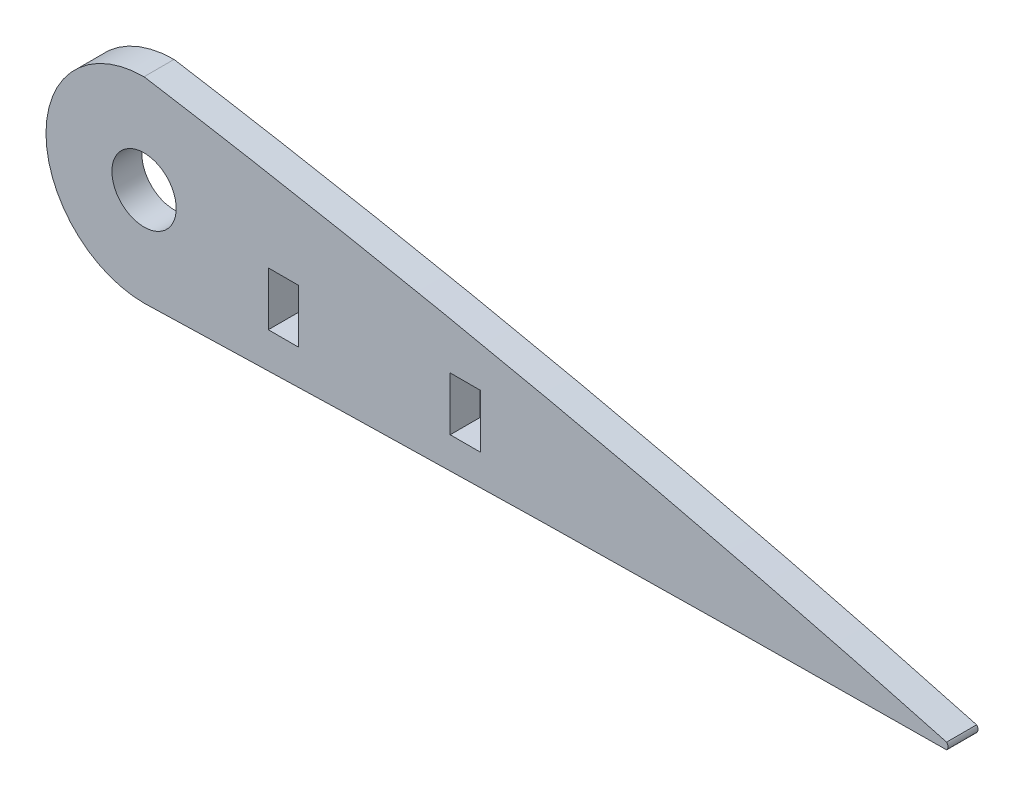
ISO-10303-21;
HEADER;
FILE_DESCRIPTION(('STEP AP214'),'2;1');
FILE_NAME('part.step','',(''),(''),'','','');
FILE_SCHEMA(('AUTOMOTIVE_DESIGN { 1 0 10303 214 1 1 1 1 }'));
ENDSEC;
DATA;
#1=APPLICATION_CONTEXT('core data for automotive mechanical design processes');
#2=APPLICATION_PROTOCOL_DEFINITION('international standard','automotive_design',2000,#1);
#3=PRODUCT_CONTEXT('',#1,'mechanical');
#4=PRODUCT('Part','Part','',(#3));
#5=PRODUCT_RELATED_PRODUCT_CATEGORY('part','',(#4));
#6=PRODUCT_DEFINITION_FORMATION('','',#4);
#7=PRODUCT_DEFINITION_CONTEXT('part definition',#1,'design');
#8=PRODUCT_DEFINITION('design','',#6,#7);
#9=PRODUCT_DEFINITION_SHAPE('','',#8);
#10=(LENGTH_UNIT() NAMED_UNIT(*) SI_UNIT(.MILLI.,.METRE.));
#11=(NAMED_UNIT(*) PLANE_ANGLE_UNIT() SI_UNIT($,.RADIAN.));
#12=(NAMED_UNIT(*) SI_UNIT($,.STERADIAN.) SOLID_ANGLE_UNIT());
#13=UNCERTAINTY_MEASURE_WITH_UNIT(LENGTH_MEASURE(1.E-05),#10,'distance_accuracy_value','');
#14=(GEOMETRIC_REPRESENTATION_CONTEXT(3) GLOBAL_UNCERTAINTY_ASSIGNED_CONTEXT((#13)) GLOBAL_UNIT_ASSIGNED_CONTEXT((#10,
#11,#12)) REPRESENTATION_CONTEXT('',''));
#15=CARTESIAN_POINT('',(0.,0.,0.));
#16=DIRECTION('',(0.,0.,1.));
#17=DIRECTION('',(1.,0.,0.));
#18=AXIS2_PLACEMENT_3D('',#15,#16,#17);
#19=CARTESIAN_POINT('',(249.685,0.,1.4));
#20=DIRECTION('',(0.,0.,-1.));
#21=DIRECTION('',(-1.,0.,0.));
#22=AXIS2_PLACEMENT_3D('',#19,#20,#21);
#23=CYLINDRICAL_SURFACE('',#22,0.445477272147512);
#24=CARTESIAN_POINT('',(249.685,0.,-1.4));
#25=DIRECTION('',(0.,0.,1.));
#26=DIRECTION('',(1.,0.,0.));
#27=AXIS2_PLACEMENT_3D('',#24,#25,#26);
#28=CIRCLE('',#27,0.445477272147512);
#29=CARTESIAN_POINT('',(250.,0.315,-1.4));
#30=VERTEX_POINT('',#29);
#31=CARTESIAN_POINT('',(250.,-0.315,-1.4));
#32=VERTEX_POINT('',#31);
#33=EDGE_CURVE('E265',#30,#32,#28,.F.);
#34=ORIENTED_EDGE('',*,*,#33,.F.);
#35=DIRECTION('',(0.,0.,-1.));
#36=VECTOR('',#35,1.);
#37=CARTESIAN_POINT('',(250.,0.315,1.4));
#38=LINE('',#37,#36);
#39=CARTESIAN_POINT('',(250.,0.315,1.4));
#40=VERTEX_POINT('',#39);
#41=EDGE_CURVE('E11',#40,#30,#38,.T.);
#42=ORIENTED_EDGE('',*,*,#41,.F.);
#43=CARTESIAN_POINT('',(249.685,0.,1.4));
#44=DIRECTION('',(0.,0.,1.));
#45=DIRECTION('',(1.,0.,0.));
#46=AXIS2_PLACEMENT_3D('',#43,#44,#45);
#47=CIRCLE('',#46,0.445477272147512);
#48=CARTESIAN_POINT('',(250.,-0.315,1.4));
#49=VERTEX_POINT('',#48);
#50=EDGE_CURVE('E146',#40,#49,#47,.F.);
#51=ORIENTED_EDGE('',*,*,#50,.T.);
#52=DIRECTION('',(0.,0.,-1.));
#53=VECTOR('',#52,1.);
#54=CARTESIAN_POINT('',(250.,-0.315,1.4));
#55=LINE('',#54,#53);
#56=EDGE_CURVE('E107',#49,#32,#55,.T.);
#57=ORIENTED_EDGE('',*,*,#56,.T.);
#58=EDGE_LOOP('',(#34,#42,#51,#57));
#59=FACE_BOUND('',#58,.T.);
#60=ADVANCED_FACE('F41',(#59),#23,.T.);
#61=CARTESIAN_POINT('',(250.,0.315,1.4));
#62=CARTESIAN_POINT('',(249.1556677398,0.545019817836279,1.4));
#63=CARTESIAN_POINT('',(246.72017569763,1.20851624251313,1.4));
#64=CARTESIAN_POINT('',(242.39133208333,2.35833905261626,1.4));
#65=CARTESIAN_POINT('',(236.8497612043,3.78762536446423,1.4));
#66=CARTESIAN_POINT('',(230.779918279366,5.29800883725429,1.4));
#67=CARTESIAN_POINT('',(224.455917947462,6.81286602762795,1.4));
#68=CARTESIAN_POINT('',(218.030543495663,8.2916106324586,1.4));
#69=CARTESIAN_POINT('',(211.562405044606,9.71973505661334,1.4));
#70=CARTESIAN_POINT('',(205.072411508973,11.0923749324442,1.4));
#71=CARTESIAN_POINT('',(198.567970912658,12.4078507263971,1.4));
#72=CARTESIAN_POINT('',(192.05236991352,13.6652979238497,1.4));
#73=CARTESIAN_POINT('',(185.527619972818,14.8640933031022,1.4));
#74=CARTESIAN_POINT('',(178.995338991115,16.0034047787228,1.4));
#75=CARTESIAN_POINT('',(172.457064741278,17.0823881152075,1.4));
#76=CARTESIAN_POINT('',(165.914317094847,18.0998278411168,1.4));
#77=CARTESIAN_POINT('',(159.368680729007,19.0545018148018,1.4));
#78=CARTESIAN_POINT('',(152.821805127969,19.9448856028229,1.4));
#79=CARTESIAN_POINT('',(146.275439401362,20.76928218283,1.4));
#80=CARTESIAN_POINT('',(139.731359791294,21.5256761133202,1.4));
#81=CARTESIAN_POINT('',(133.191836730309,22.2120042488889,1.4));
#82=CARTESIAN_POINT('',(126.658683026114,22.8257214286805,1.4));
#83=CARTESIAN_POINT('',(120.136770918309,23.363973266088,1.4));
#84=CARTESIAN_POINT('',(113.628567140501,23.8246773240715,1.4));
#85=CARTESIAN_POINT('',(107.152732037453,24.2002425936989,1.4));
#86=CARTESIAN_POINT('',(100.741095692949,24.4983995100481,1.4));
#87=CARTESIAN_POINT('',(94.4117527148801,24.6866497684384,1.4));
#88=CARTESIAN_POINT('',(88.1559179929208,24.7400956502598,1.4));
#89=CARTESIAN_POINT('',(81.9490430552625,24.658849143563,1.4));
#90=CARTESIAN_POINT('',(75.7805205915729,24.4410138083138,1.4));
#91=CARTESIAN_POINT('',(69.653692942001,24.0818848206021,1.4));
#92=CARTESIAN_POINT('',(63.5754105017725,23.5780063609574,1.4));
#93=CARTESIAN_POINT('',(57.5551895509689,22.9249466580897,1.4));
#94=CARTESIAN_POINT('',(51.6057626883655,22.1190655216041,1.4));
#95=CARTESIAN_POINT('',(45.7444003114454,21.1565644320825,1.4));
#96=CARTESIAN_POINT('',(39.9958575941734,20.035371389506,1.4));
#97=CARTESIAN_POINT('',(34.397919842374,18.756316234168,1.4));
#98=CARTESIAN_POINT('',(29.0103821035244,17.327615607561,1.4));
#99=CARTESIAN_POINT('',(23.9257984082512,15.7718649214876,1.4));
#100=CARTESIAN_POINT('',(19.2706788398757,14.1342694339559,1.4));
#101=CARTESIAN_POINT('',(15.1790983912921,12.4833354375465,1.4));
#102=CARTESIAN_POINT('',(11.7404757900967,10.8956109948061,1.4));
#103=CARTESIAN_POINT('',(8.95937186897629,9.42957736532332,1.4));
#104=CARTESIAN_POINT('',(6.76089118010329,8.10860319940964,1.4));
#105=CARTESIAN_POINT('',(5.03370974806799,6.92463805475642,1.4));
#106=CARTESIAN_POINT('',(3.67169493343308,5.85422966432144,1.4));
#107=CARTESIAN_POINT('',(2.59210112319415,4.87130536863603,1.4));
#108=CARTESIAN_POINT('',(1.73817566850273,3.95259574329487,1.4));
#109=CARTESIAN_POINT('',(1.06987082981603,3.08094637334676,1.4));
#110=CARTESIAN_POINT('',(0.571645410381898,2.24162210227498,1.4));
#111=CARTESIAN_POINT('',(0.215773898828885,1.43078539700941,1.4));
#112=CARTESIAN_POINT('',(0.102255581551055,0.88324169451159,1.4));
#113=CARTESIAN_POINT('',(0.047975,0.621425,1.4));
#114=B_SPLINE_CURVE_WITH_KNOTS('',3,(#61,#62,#63,#64,#65,#66,#67,#68,#69,#70,#71,#72,#73,#74,
#75,#76,#77,#78,#79,#80,#81,#82,#83,#84,#85,#86,#87,#88,#89,#90,#91,#92,#93,#94,#95,#96,#97,#98,
#99,#100,#101,#102,#103,#104,#105,#106,#107,#108,#109,#110,#111,#112,#113),.UNSPECIFIED.,.F.,
.F.,(4,1,1,1,1,1,1,1,1,1,1,1,1,1,1,1,1,1,1,1,1,1,1,1,1,1,1,1,1,1,1,1,1,1,1,1,1,1,1,1,1,1,1,1,1,
1,1,1,1,1,4),(0.,0.0101621996718152,0.029313053164405,0.0520116049167946,0.0766194676467142,
0.101948061207292,0.127526131749972,0.153184130655642,0.178867887696566,0.204557902716051,
0.230245711588722,0.255925967287604,0.281594302232909,0.307246419826604,0.332878041533464,
0.358484538095463,0.384061185999046,0.409602822472883,0.435103874040524,0.460559416336008,
0.485959195382529,0.511303069995141,0.53655151535457,0.561723365940153,0.586628866723787,
0.611085431247163,0.63525120042125,0.659272175841394,0.683163753229342,0.706922144180534,
0.730535909866309,0.753983199646257,0.777234690063445,0.800246382303428,0.822950708941546,
0.845237155368769,0.866915895838024,0.887662334604257,0.906968280539555,0.924203157053238,
0.938878974509372,0.95093161065299,0.960693484285195,0.968646729467272,0.975232933115936,
0.980794743901537,0.985583761312909,0.989781538836832,0.99352131251264,0.996902112954681,1.),.UNSPECIFIED.);
#115=DIRECTION('',(0.,0.,-1.));
#116=VECTOR('',#115,1.);
#117=SURFACE_OF_LINEAR_EXTRUSION('',#114,#116);
#118=CARTESIAN_POINT('',(250.,0.315,-1.4));
#119=CARTESIAN_POINT('',(249.1556677398,0.545019817836279,-1.4));
#120=CARTESIAN_POINT('',(246.72017569763,1.20851624251313,-1.4));
#121=CARTESIAN_POINT('',(242.39133208333,2.35833905261626,-1.4));
#122=CARTESIAN_POINT('',(236.8497612043,3.78762536446423,-1.4));
#123=CARTESIAN_POINT('',(230.779918279366,5.29800883725429,-1.4));
#124=CARTESIAN_POINT('',(224.455917947462,6.81286602762795,-1.4));
#125=CARTESIAN_POINT('',(218.030543495663,8.2916106324586,-1.4));
#126=CARTESIAN_POINT('',(211.562405044606,9.71973505661334,-1.4));
#127=CARTESIAN_POINT('',(205.072411508973,11.0923749324442,-1.4));
#128=CARTESIAN_POINT('',(198.567970912658,12.4078507263971,-1.4));
#129=CARTESIAN_POINT('',(192.05236991352,13.6652979238497,-1.4));
#130=CARTESIAN_POINT('',(185.527619972818,14.8640933031022,-1.4));
#131=CARTESIAN_POINT('',(178.995338991115,16.0034047787228,-1.4));
#132=CARTESIAN_POINT('',(172.457064741278,17.0823881152075,-1.4));
#133=CARTESIAN_POINT('',(165.914317094847,18.0998278411168,-1.4));
#134=CARTESIAN_POINT('',(159.368680729007,19.0545018148018,-1.4));
#135=CARTESIAN_POINT('',(152.821805127969,19.9448856028229,-1.4));
#136=CARTESIAN_POINT('',(146.275439401362,20.76928218283,-1.4));
#137=CARTESIAN_POINT('',(139.731359791294,21.5256761133202,-1.4));
#138=CARTESIAN_POINT('',(133.191836730309,22.2120042488889,-1.4));
#139=CARTESIAN_POINT('',(126.658683026114,22.8257214286805,-1.4));
#140=CARTESIAN_POINT('',(120.136770918309,23.363973266088,-1.4));
#141=CARTESIAN_POINT('',(113.628567140501,23.8246773240715,-1.4));
#142=CARTESIAN_POINT('',(107.152732037453,24.2002425936989,-1.4));
#143=CARTESIAN_POINT('',(100.741095692949,24.4983995100481,-1.4));
#144=CARTESIAN_POINT('',(94.4117527148801,24.6866497684384,-1.4));
#145=CARTESIAN_POINT('',(88.1559179929208,24.7400956502598,-1.4));
#146=CARTESIAN_POINT('',(81.9490430552625,24.658849143563,-1.4));
#147=CARTESIAN_POINT('',(75.7805205915729,24.4410138083138,-1.4));
#148=CARTESIAN_POINT('',(69.653692942001,24.0818848206021,-1.4));
#149=CARTESIAN_POINT('',(63.5754105017725,23.5780063609574,-1.4));
#150=CARTESIAN_POINT('',(57.5551895509689,22.9249466580897,-1.4));
#151=CARTESIAN_POINT('',(51.6057626883655,22.1190655216041,-1.4));
#152=CARTESIAN_POINT('',(45.7444003114454,21.1565644320825,-1.4));
#153=CARTESIAN_POINT('',(39.9958575941734,20.035371389506,-1.4));
#154=CARTESIAN_POINT('',(34.397919842374,18.756316234168,-1.4));
#155=CARTESIAN_POINT('',(29.0103821035244,17.327615607561,-1.4));
#156=CARTESIAN_POINT('',(23.9257984082512,15.7718649214876,-1.4));
#157=CARTESIAN_POINT('',(19.2706788398757,14.1342694339559,-1.4));
#158=CARTESIAN_POINT('',(15.1790983912921,12.4833354375465,-1.4));
#159=CARTESIAN_POINT('',(11.7404757900967,10.8956109948061,-1.4));
#160=CARTESIAN_POINT('',(8.95937186897629,9.42957736532332,-1.4));
#161=CARTESIAN_POINT('',(6.76089118010329,8.10860319940964,-1.4));
#162=CARTESIAN_POINT('',(5.03370974806799,6.92463805475642,-1.4));
#163=CARTESIAN_POINT('',(3.67169493343308,5.85422966432144,-1.4));
#164=CARTESIAN_POINT('',(2.59210112319415,4.87130536863603,-1.4));
#165=CARTESIAN_POINT('',(1.73817566850273,3.95259574329487,-1.4));
#166=CARTESIAN_POINT('',(1.06987082981603,3.08094637334676,-1.4));
#167=CARTESIAN_POINT('',(0.571645410381898,2.24162210227498,-1.4));
#168=CARTESIAN_POINT('',(0.215773898828885,1.43078539700941,-1.4));
#169=CARTESIAN_POINT('',(0.102255581551055,0.88324169451159,-1.4));
#170=CARTESIAN_POINT('',(0.047975,0.621425,-1.4));
#171=B_SPLINE_CURVE_WITH_KNOTS('',3,(#118,#119,#120,#121,#122,#123,#124,#125,#126,#127,#128,
#129,#130,#131,#132,#133,#134,#135,#136,#137,#138,#139,#140,#141,#142,#143,#144,#145,#146,#147,
#148,#149,#150,#151,#152,#153,#154,#155,#156,#157,#158,#159,#160,#161,#162,#163,#164,#165,#166,
#167,#168,#169,#170),.UNSPECIFIED.,.F.,.F.,(4,1,1,1,1,1,1,1,1,1,1,1,1,1,1,1,1,1,1,1,1,1,1,1,1,1,
1,1,1,1,1,1,1,1,1,1,1,1,1,1,1,1,1,1,1,1,1,1,1,1,4),(0.,0.0101621996718152,0.029313053164405,
0.0520116049167946,0.0766194676467142,0.101948061207292,0.127526131749972,0.153184130655642,
0.178867887696566,0.204557902716051,0.230245711588722,0.255925967287604,0.281594302232909,
0.307246419826604,0.332878041533464,0.358484538095463,0.384061185999046,0.409602822472883,
0.435103874040524,0.460559416336008,0.485959195382529,0.511303069995141,0.53655151535457,
0.561723365940153,0.586628866723787,0.611085431247163,0.63525120042125,0.659272175841394,
0.683163753229342,0.706922144180534,0.730535909866309,0.753983199646257,0.777234690063445,
0.800246382303428,0.822950708941546,0.845237155368769,0.866915895838024,0.887662334604257,
0.906968280539555,0.924203157053238,0.938878974509372,0.95093161065299,0.960693484285195,
0.968646729467272,0.975232933115936,0.980794743901537,0.985583761312909,0.989781538836832,
0.99352131251264,0.996902112954681,1.),.UNSPECIFIED.);
#172=CARTESIAN_POINT('',(175.091334090503,16.6447875148628,-1.4));
#173=VERTEX_POINT('',#172);
#174=EDGE_CURVE('E153',#30,#173,#171,.T.);
#175=ORIENTED_EDGE('',*,*,#174,.T.);
#176=DIRECTION('',(0.,0.,-1.));
#177=VECTOR('',#176,1.);
#178=CARTESIAN_POINT('',(175.091334090503,16.6447875148628,1.4));
#179=LINE('',#178,#177);
#180=CARTESIAN_POINT('',(175.091334090503,16.6447875148628,1.4));
#181=VERTEX_POINT('',#180);
#182=EDGE_CURVE('E52',#181,#173,#179,.T.);
#183=ORIENTED_EDGE('',*,*,#182,.F.);
#184=EDGE_CURVE('E141',#40,#181,#114,.T.);
#185=ORIENTED_EDGE('',*,*,#184,.F.);
#186=ORIENTED_EDGE('',*,*,#41,.T.);
#187=EDGE_LOOP('',(#175,#183,#185,#186));
#188=FACE_BOUND('',#187,.T.);
#189=ADVANCED_FACE('F151',(#188),#117,.F.);
#190=CARTESIAN_POINT('',(175.091334090503,7.49391035659057,1.4));
#191=DIRECTION('',(0.,0.,-1.));
#192=DIRECTION('',(-1.,0.,0.));
#193=AXIS2_PLACEMENT_3D('',#190,#191,#192);
#194=CYLINDRICAL_SURFACE('',#193,9.15087715827226);
#195=CARTESIAN_POINT('',(175.091334090503,7.49391035659057,-1.4));
#196=DIRECTION('',(0.,0.,1.));
#197=DIRECTION('',(1.,0.,0.));
#198=AXIS2_PLACEMENT_3D('',#195,#196,#197);
#199=CIRCLE('',#198,9.15087715827226);
#200=CARTESIAN_POINT('',(175.091334090503,-1.65696680168169,-1.4));
#201=VERTEX_POINT('',#200);
#202=EDGE_CURVE('E273',#201,#173,#199,.F.);
#203=ORIENTED_EDGE('',*,*,#202,.F.);
#204=DIRECTION('',(0.,0.,-1.));
#205=VECTOR('',#204,1.);
#206=CARTESIAN_POINT('',(175.091334090503,-1.65696680168169,1.4));
#207=LINE('',#206,#205);
#208=CARTESIAN_POINT('',(175.091334090503,-1.65696680168169,1.4));
#209=VERTEX_POINT('',#208);
#210=EDGE_CURVE('E100',#209,#201,#207,.T.);
#211=ORIENTED_EDGE('',*,*,#210,.F.);
#212=CARTESIAN_POINT('',(175.091334090503,7.49391035659057,1.4));
#213=DIRECTION('',(0.,0.,1.));
#214=DIRECTION('',(1.,0.,0.));
#215=AXIS2_PLACEMENT_3D('',#212,#213,#214);
#216=CIRCLE('',#215,9.15087715827226);
#217=EDGE_CURVE('E145',#209,#181,#216,.F.);
#218=ORIENTED_EDGE('',*,*,#217,.T.);
#219=ORIENTED_EDGE('',*,*,#182,.T.);
#220=EDGE_LOOP('',(#203,#211,#218,#219));
#221=FACE_BOUND('',#220,.T.);
#222=ADVANCED_FACE('F159',(#221),#194,.T.);
#223=CARTESIAN_POINT('',(189.491334090503,-1.05188821037107E-12,1.4));
#224=DIRECTION('',(-1.,0.,0.));
#225=DIRECTION('',(0.,-1.,0.));
#226=AXIS2_PLACEMENT_3D('',#223,#224,#225);
#227=PLANE('',#226);
#228=DIRECTION('',(0.,1.,0.));
#229=VECTOR('',#228,1.);
#230=CARTESIAN_POINT('',(189.491334090503,-1.05188821037107E-12,-1.4));
#231=LINE('',#230,#229);
#232=CARTESIAN_POINT('',(189.491334090503,1.99391035659059,-1.4));
#233=VERTEX_POINT('',#232);
#234=CARTESIAN_POINT('',(189.491334090503,6.99391035659059,-1.4));
#235=VERTEX_POINT('',#234);
#236=EDGE_CURVE('E243',#233,#235,#231,.T.);
#237=ORIENTED_EDGE('',*,*,#236,.F.);
#238=DIRECTION('',(0.,0.,-1.));
#239=VECTOR('',#238,1.);
#240=CARTESIAN_POINT('',(189.491334090503,1.99391035659059,1.4));
#241=LINE('',#240,#239);
#242=CARTESIAN_POINT('',(189.491334090503,1.99391035659059,1.4));
#243=VERTEX_POINT('',#242);
#244=EDGE_CURVE('E290',#243,#233,#241,.T.);
#245=ORIENTED_EDGE('',*,*,#244,.F.);
#246=DIRECTION('',(0.,1.,0.));
#247=VECTOR('',#246,1.);
#248=CARTESIAN_POINT('',(189.491334090503,-1.05188821037107E-12,1.4));
#249=LINE('',#248,#247);
#250=CARTESIAN_POINT('',(189.491334090503,6.99391035659059,1.4));
#251=VERTEX_POINT('',#250);
#252=EDGE_CURVE('E321',#243,#251,#249,.T.);
#253=ORIENTED_EDGE('',*,*,#252,.T.);
#254=DIRECTION('',(0.,0.,-1.));
#255=VECTOR('',#254,1.);
#256=CARTESIAN_POINT('',(189.491334090503,6.99391035659059,1.4));
#257=LINE('',#256,#255);
#258=EDGE_CURVE('E293',#251,#235,#257,.T.);
#259=ORIENTED_EDGE('',*,*,#258,.T.);
#260=EDGE_LOOP('',(#237,#245,#253,#259));
#261=FACE_BOUND('',#260,.T.);
#262=ADVANCED_FACE('F188',(#261),#227,.T.);
#263=CARTESIAN_POINT('',(0.,1.99391035659056,1.4));
#264=DIRECTION('',(0.,1.,0.));
#265=DIRECTION('',(-1.,0.,0.));
#266=AXIS2_PLACEMENT_3D('',#263,#264,#265);
#267=PLANE('',#266);
#268=DIRECTION('',(1.,0.,0.));
#269=VECTOR('',#268,1.);
#270=CARTESIAN_POINT('',(0.,1.99391035659056,-1.4));
#271=LINE('',#270,#269);
#272=CARTESIAN_POINT('',(186.691334090503,1.99391035659058,-1.4));
#273=VERTEX_POINT('',#272);
#274=EDGE_CURVE('E249',#273,#233,#271,.T.);
#275=ORIENTED_EDGE('',*,*,#274,.F.);
#276=DIRECTION('',(0.,0.,-1.));
#277=VECTOR('',#276,1.);
#278=CARTESIAN_POINT('',(186.691334090503,1.99391035659058,1.4));
#279=LINE('',#278,#277);
#280=CARTESIAN_POINT('',(186.691334090503,1.99391035659058,1.4));
#281=VERTEX_POINT('',#280);
#282=EDGE_CURVE('E300',#281,#273,#279,.T.);
#283=ORIENTED_EDGE('',*,*,#282,.F.);
#284=DIRECTION('',(1.,0.,0.));
#285=VECTOR('',#284,1.);
#286=CARTESIAN_POINT('',(0.,1.99391035659056,1.4));
#287=LINE('',#286,#285);
#288=EDGE_CURVE('E329',#281,#243,#287,.T.);
#289=ORIENTED_EDGE('',*,*,#288,.T.);
#290=ORIENTED_EDGE('',*,*,#244,.T.);
#291=EDGE_LOOP('',(#275,#283,#289,#290));
#292=FACE_BOUND('',#291,.T.);
#293=ADVANCED_FACE('F205',(#292),#267,.T.);
#294=CARTESIAN_POINT('',(186.691334090503,0.,1.4));
#295=DIRECTION('',(-1.,0.,0.));
#296=DIRECTION('',(0.,0.,1.));
#297=AXIS2_PLACEMENT_3D('',#294,#295,#296);
#298=PLANE('',#297);
#299=DIRECTION('',(0.,1.,0.));
#300=VECTOR('',#299,1.);
#301=CARTESIAN_POINT('',(186.691334090503,0.,-1.4));
#302=LINE('',#301,#300);
#303=CARTESIAN_POINT('',(186.691334090503,6.99391035659059,-1.4));
#304=VERTEX_POINT('',#303);
#305=EDGE_CURVE('E253',#273,#304,#302,.T.);
#306=ORIENTED_EDGE('',*,*,#305,.T.);
#307=DIRECTION('',(0.,0.,-1.));
#308=VECTOR('',#307,1.);
#309=CARTESIAN_POINT('',(186.691334090503,6.99391035659059,1.4));
#310=LINE('',#309,#308);
#311=CARTESIAN_POINT('',(186.691334090503,6.99391035659059,1.4));
#312=VERTEX_POINT('',#311);
#313=EDGE_CURVE('E296',#312,#304,#310,.T.);
#314=ORIENTED_EDGE('',*,*,#313,.F.);
#315=DIRECTION('',(0.,1.,0.));
#316=VECTOR('',#315,1.);
#317=CARTESIAN_POINT('',(186.691334090503,0.,1.4));
#318=LINE('',#317,#316);
#319=EDGE_CURVE('E333',#281,#312,#318,.T.);
#320=ORIENTED_EDGE('',*,*,#319,.F.);
#321=ORIENTED_EDGE('',*,*,#282,.T.);
#322=EDGE_LOOP('',(#306,#314,#320,#321));
#323=FACE_BOUND('',#322,.T.);
#324=ADVANCED_FACE('F202',(#323),#298,.F.);
#325=CARTESIAN_POINT('',(0.,6.99391035659057,1.4));
#326=DIRECTION('',(0.,1.,0.));
#327=DIRECTION('',(0.,0.,1.));
#328=AXIS2_PLACEMENT_3D('',#325,#326,#327);
#329=PLANE('',#328);
#330=DIRECTION('',(1.,0.,0.));
#331=VECTOR('',#330,1.);
#332=CARTESIAN_POINT('',(0.,6.99391035659057,-1.4));
#333=LINE('',#332,#331);
#334=CARTESIAN_POINT('',(203.666334090503,6.99391035659057,-1.4));
#335=VERTEX_POINT('',#334);
#336=CARTESIAN_POINT('',(206.516334090503,6.99391035659057,-1.4));
#337=VERTEX_POINT('',#336);
#338=EDGE_CURVE('E173',#335,#337,#333,.T.);
#339=ORIENTED_EDGE('',*,*,#338,.T.);
#340=DIRECTION('',(0.,0.,-1.));
#341=VECTOR('',#340,1.);
#342=CARTESIAN_POINT('',(206.516334090503,6.99391035659057,1.4));
#343=LINE('',#342,#341);
#344=CARTESIAN_POINT('',(206.516334090503,6.99391035659057,1.4));
#345=VERTEX_POINT('',#344);
#346=EDGE_CURVE('E45',#345,#337,#343,.T.);
#347=ORIENTED_EDGE('',*,*,#346,.F.);
#348=DIRECTION('',(1.,0.,0.));
#349=VECTOR('',#348,1.);
#350=CARTESIAN_POINT('',(0.,6.99391035659057,1.4));
#351=LINE('',#350,#349);
#352=CARTESIAN_POINT('',(203.666334090503,6.99391035659057,1.4));
#353=VERTEX_POINT('',#352);
#354=EDGE_CURVE('E284',#353,#345,#351,.T.);
#355=ORIENTED_EDGE('',*,*,#354,.F.);
#356=DIRECTION('',(0.,0.,-1.));
#357=VECTOR('',#356,1.);
#358=CARTESIAN_POINT('',(203.666334090503,6.99391035659057,1.4));
#359=LINE('',#358,#357);
#360=EDGE_CURVE('E163',#353,#335,#359,.T.);
#361=ORIENTED_EDGE('',*,*,#360,.T.);
#362=EDGE_LOOP('',(#339,#347,#355,#361));
#363=FACE_BOUND('',#362,.T.);
#364=ADVANCED_FACE('F43',(#363),#329,.F.);
#365=CARTESIAN_POINT('',(206.516334090503,0.,1.4));
#366=DIRECTION('',(1.,0.,0.));
#367=DIRECTION('',(0.,0.,-1.));
#368=AXIS2_PLACEMENT_3D('',#365,#366,#367);
#369=PLANE('',#368);
#370=DIRECTION('',(0.,-1.,0.));
#371=VECTOR('',#370,1.);
#372=CARTESIAN_POINT('',(206.516334090503,0.,-1.4));
#373=LINE('',#372,#371);
#374=CARTESIAN_POINT('',(206.516334090503,1.99391035659057,-1.4));
#375=VERTEX_POINT('',#374);
#376=EDGE_CURVE('E225',#337,#375,#373,.T.);
#377=ORIENTED_EDGE('',*,*,#376,.T.);
#378=DIRECTION('',(0.,0.,-1.));
#379=VECTOR('',#378,1.);
#380=CARTESIAN_POINT('',(206.516334090503,1.99391035659057,1.4));
#381=LINE('',#380,#379);
#382=CARTESIAN_POINT('',(206.516334090503,1.99391035659057,1.4));
#383=VERTEX_POINT('',#382);
#384=EDGE_CURVE('E227',#383,#375,#381,.T.);
#385=ORIENTED_EDGE('',*,*,#384,.F.);
#386=DIRECTION('',(0.,-1.,0.));
#387=VECTOR('',#386,1.);
#388=CARTESIAN_POINT('',(206.516334090503,0.,1.4));
#389=LINE('',#388,#387);
#390=EDGE_CURVE('E115',#345,#383,#389,.T.);
#391=ORIENTED_EDGE('',*,*,#390,.F.);
#392=ORIENTED_EDGE('',*,*,#346,.T.);
#393=EDGE_LOOP('',(#377,#385,#391,#392));
#394=FACE_BOUND('',#393,.T.);
#395=ADVANCED_FACE('F217',(#394),#369,.F.);
#396=CARTESIAN_POINT('',(0.,1.9939103565906,1.4));
#397=DIRECTION('',(0.,1.,0.));
#398=DIRECTION('',(-1.,0.,0.));
#399=AXIS2_PLACEMENT_3D('',#396,#397,#398);
#400=PLANE('',#399);
#401=DIRECTION('',(1.,0.,0.));
#402=VECTOR('',#401,1.);
#403=CARTESIAN_POINT('',(0.,1.9939103565906,-1.4));
#404=LINE('',#403,#402);
#405=CARTESIAN_POINT('',(203.666334090503,1.99391035659057,-1.4));
#406=VERTEX_POINT('',#405);
#407=EDGE_CURVE('E234',#406,#375,#404,.T.);
#408=ORIENTED_EDGE('',*,*,#407,.F.);
#409=DIRECTION('',(0.,0.,-1.));
#410=VECTOR('',#409,1.);
#411=CARTESIAN_POINT('',(203.666334090503,1.99391035659057,1.4));
#412=LINE('',#411,#410);
#413=CARTESIAN_POINT('',(203.666334090503,1.99391035659057,1.4));
#414=VERTEX_POINT('',#413);
#415=EDGE_CURVE('E307',#414,#406,#412,.T.);
#416=ORIENTED_EDGE('',*,*,#415,.F.);
#417=DIRECTION('',(1.,0.,0.));
#418=VECTOR('',#417,1.);
#419=CARTESIAN_POINT('',(0.,1.9939103565906,1.4));
#420=LINE('',#419,#418);
#421=EDGE_CURVE('E312',#414,#383,#420,.T.);
#422=ORIENTED_EDGE('',*,*,#421,.T.);
#423=ORIENTED_EDGE('',*,*,#384,.T.);
#424=EDGE_LOOP('',(#408,#416,#422,#423));
#425=FACE_BOUND('',#424,.T.);
#426=ADVANCED_FACE('F197',(#425),#400,.T.);
#427=CARTESIAN_POINT('',(175.091334090503,7.49391035659057,1.4));
#428=DIRECTION('',(0.,0.,-1.));
#429=DIRECTION('',(-1.,0.,0.));
#430=AXIS2_PLACEMENT_3D('',#427,#428,#429);
#431=CYLINDRICAL_SURFACE('',#430,2.99999999999999);
#432=CARTESIAN_POINT('',(175.091334090503,7.49391035659057,1.4));
#433=DIRECTION('',(0.,0.,1.));
#434=DIRECTION('',(1.,0.,0.));
#435=AXIS2_PLACEMENT_3D('',#432,#433,#434);
#436=CIRCLE('',#435,2.99999999999999);
#437=CARTESIAN_POINT('',(178.091334090503,7.49391035659057,1.4));
#438=VERTEX_POINT('',#437);
#439=EDGE_CURVE('E340',#438,#438,#436,.T.);
#440=ORIENTED_EDGE('',*,*,#439,.T.);
#441=EDGE_LOOP('',(#440));
#442=FACE_BOUND('',#441,.T.);
#443=CARTESIAN_POINT('',(175.091334090503,7.49391035659057,-1.4));
#444=DIRECTION('',(0.,0.,1.));
#445=DIRECTION('',(1.,0.,0.));
#446=AXIS2_PLACEMENT_3D('',#443,#444,#445);
#447=CIRCLE('',#446,2.99999999999999);
#448=CARTESIAN_POINT('',(178.091334090503,7.49391035659057,-1.4));
#449=VERTEX_POINT('',#448);
#450=EDGE_CURVE('E261',#449,#449,#447,.T.);
#451=ORIENTED_EDGE('',*,*,#450,.F.);
#452=EDGE_LOOP('',(#451));
#453=FACE_BOUND('',#452,.T.);
#454=ADVANCED_FACE('F193',(#442,#453),#431,.F.);
#455=CARTESIAN_POINT('',(0.,6.99391035659053,1.4));
#456=DIRECTION('',(0.,1.,0.));
#457=DIRECTION('',(-1.,0.,0.));
#458=AXIS2_PLACEMENT_3D('',#455,#456,#457);
#459=PLANE('',#458);
#460=DIRECTION('',(1.,0.,0.));
#461=VECTOR('',#460,1.);
#462=CARTESIAN_POINT('',(0.,6.99391035659053,-1.4));
#463=LINE('',#462,#461);
#464=EDGE_CURVE('E257',#304,#235,#463,.T.);
#465=ORIENTED_EDGE('',*,*,#464,.T.);
#466=ORIENTED_EDGE('',*,*,#258,.F.);
#467=DIRECTION('',(1.,0.,0.));
#468=VECTOR('',#467,1.);
#469=CARTESIAN_POINT('',(0.,6.99391035659053,1.4));
#470=LINE('',#469,#468);
#471=EDGE_CURVE('E337',#312,#251,#470,.T.);
#472=ORIENTED_EDGE('',*,*,#471,.F.);
#473=ORIENTED_EDGE('',*,*,#313,.T.);
#474=EDGE_LOOP('',(#465,#466,#472,#473));
#475=FACE_BOUND('',#474,.T.);
#476=ADVANCED_FACE('F196',(#475),#459,.F.);
#477=CARTESIAN_POINT('',(203.666334090503,0.,1.4));
#478=DIRECTION('',(1.,0.,0.));
#479=DIRECTION('',(0.,0.,-1.));
#480=AXIS2_PLACEMENT_3D('',#477,#478,#479);
#481=PLANE('',#480);
#482=DIRECTION('',(0.,-1.,0.));
#483=VECTOR('',#482,1.);
#484=CARTESIAN_POINT('',(203.666334090503,0.,-1.4));
#485=LINE('',#484,#483);
#486=EDGE_CURVE('E239',#335,#406,#485,.T.);
#487=ORIENTED_EDGE('',*,*,#486,.F.);
#488=ORIENTED_EDGE('',*,*,#360,.F.);
#489=DIRECTION('',(0.,-1.,0.));
#490=VECTOR('',#489,1.);
#491=CARTESIAN_POINT('',(203.666334090503,0.,1.4));
#492=LINE('',#491,#490);
#493=EDGE_CURVE('E317',#353,#414,#492,.T.);
#494=ORIENTED_EDGE('',*,*,#493,.T.);
#495=ORIENTED_EDGE('',*,*,#415,.T.);
#496=EDGE_LOOP('',(#487,#488,#494,#495));
#497=FACE_BOUND('',#496,.T.);
#498=ADVANCED_FACE('F183',(#497),#481,.T.);
#499=CARTESIAN_POINT('',(0.047975,0.621425,1.4));
#500=CARTESIAN_POINT('',(0.0227138203276048,0.373490085622791,1.4));
#501=CARTESIAN_POINT('',(-0.0278207890067418,-0.122499975050766,1.4));
#502=CARTESIAN_POINT('',(0.0779912124025658,-0.884434590165201,1.4));
#503=CARTESIAN_POINT('',(0.349695650479558,-1.63883807038276,1.4));
#504=CARTESIAN_POINT('',(0.814331135146287,-2.36506892355371,1.4));
#505=CARTESIAN_POINT('',(1.46348078042047,-3.03927524464629,1.4));
#506=CARTESIAN_POINT('',(2.29097301668935,-3.66099946963366,1.4));
#507=CARTESIAN_POINT('',(3.30592875031006,-4.23577962104374,1.4));
#508=CARTESIAN_POINT('',(4.53525561919462,-4.77367414359886,1.4));
#509=CARTESIAN_POINT('',(6.02974568831117,-5.28219216459101,1.4));
#510=CARTESIAN_POINT('',(7.86898121528962,-5.76531667645348,1.4));
#511=CARTESIAN_POINT('',(10.1688313918654,-6.22171659288376,1.4));
#512=CARTESIAN_POINT('',(13.0754381888996,-6.63961873115542,1.4));
#513=CARTESIAN_POINT('',(16.7281153626706,-6.9929567376365,1.4));
#514=CARTESIAN_POINT('',(21.1899520960701,-7.24734514465608,1.4));
#515=CARTESIAN_POINT('',(26.3999844156156,-7.37663884892169,1.4));
#516=CARTESIAN_POINT('',(32.1973985639414,-7.3762569130408,1.4));
#517=CARTESIAN_POINT('',(38.3978067590662,-7.26143657976799,1.4));
#518=CARTESIAN_POINT('',(44.8576217679783,-7.05664135813184,1.4));
#519=CARTESIAN_POINT('',(51.4865430961494,-6.78645353187047,1.4));
#520=CARTESIAN_POINT('',(58.2309809321351,-6.47232458681409,1.4));
#521=CARTESIAN_POINT('',(65.0520946060131,-6.13285226454697,1.4));
#522=CARTESIAN_POINT('',(71.9107727092338,-5.78400517676069,1.4));
#523=CARTESIAN_POINT('',(78.7713755761997,-5.43968045365919,1.4));
#524=CARTESIAN_POINT('',(85.6104986098046,-5.1109512525955,1.4));
#525=CARTESIAN_POINT('',(92.4321075899298,-4.80495332575523,1.4));
#526=CARTESIAN_POINT('',(99.2550311901141,-4.53198165486052,1.4));
#527=CARTESIAN_POINT('',(106.097378404906,-4.2782746709768,1.4));
#528=CARTESIAN_POINT('',(112.96921168025,-4.00308992595863,1.4));
#529=CARTESIAN_POINT('',(119.864404254545,-3.72317618427209,1.4));
#530=CARTESIAN_POINT('',(126.773860473488,-3.44006729642004,1.4));
#531=CARTESIAN_POINT('',(133.681563213165,-3.15869560044929,1.4));
#532=CARTESIAN_POINT('',(140.581870407101,-2.88238072043892,1.4));
#533=CARTESIAN_POINT('',(147.472013761627,-2.6139229582865,1.4));
#534=CARTESIAN_POINT('',(154.352602410646,-2.35562641484789,1.4));
#535=CARTESIAN_POINT('',(161.225044134142,-2.10936992107383,1.4));
#536=CARTESIAN_POINT('',(168.090869746121,-1.87663407429386,1.4));
#537=CARTESIAN_POINT('',(174.951578521953,-1.65864310401416,1.4));
#538=CARTESIAN_POINT('',(181.808595965615,-1.45637812303537,1.4));
#539=CARTESIAN_POINT('',(188.663234462377,-1.27038337720763,1.4));
#540=CARTESIAN_POINT('',(195.516645167653,-1.10111288413947,1.4));
#541=CARTESIAN_POINT('',(202.369532893738,-0.948617188746303,1.4));
#542=CARTESIAN_POINT('',(211.499190290366,-0.767742353448254,1.4));
#543=CARTESIAN_POINT('',(220.6030986659,-0.619939742232208,1.4));
#544=CARTESIAN_POINT('',(229.617630172189,-0.502926179992112,1.4));
#545=CARTESIAN_POINT('',(236.087353853958,-0.431514191705789,1.4));
#546=CARTESIAN_POINT('',(241.980776912644,-0.376520461448702,1.4));
#547=CARTESIAN_POINT('',(246.558970010782,-0.339535885915444,1.4));
#548=CARTESIAN_POINT('',(249.120490964528,-0.321271242454606,1.4));
#549=CARTESIAN_POINT('',(250.,-0.315,1.4));
#550=B_SPLINE_CURVE_WITH_KNOTS('',3,(#499,#500,#501,#502,#503,#504,#505,#506,#507,#508,#509,
#510,#511,#512,#513,#514,#515,#516,#517,#518,#519,#520,#521,#522,#523,#524,#525,#526,#527,#528,
#529,#530,#531,#532,#533,#534,#535,#536,#537,#538,#539,#540,#541,#542,#543,#544,#545,#546,#547,
#548,#549),.UNSPECIFIED.,.F.,.F.,(4,1,1,1,1,1,1,1,1,1,1,1,1,1,1,1,1,1,1,1,1,1,1,1,1,1,1,1,1,1,1,
1,1,1,1,1,1,1,1,1,1,1,1,1,1,1,1,1,4),(0.,0.00294144629716841,0.00588431899986843,
0.00901612990907169,0.0123645467308032,0.0160079338878462,0.0200368451305784,0.0245737277973679,
0.029783834741521,0.0358970100073663,0.043240439578336,0.0522759653413005,0.0636345893302709,
0.0779831757705632,0.0956981612833506,0.116520086015495,0.139660730330278,0.164312170171254,
0.189918890388145,0.216157201054431,0.242837761985605,0.269833582781319,0.296993021546457,
0.324123271890544,0.351139106824528,0.378035508721976,0.404946015910257,0.431960836658272,
0.459078394602815,0.486347400324305,0.513640830241323,0.540928594677757,0.568176028038828,
0.595379568955062,0.622543444942076,0.6496732603013,0.676775201241309,0.70385522836994,
0.730918774891245,0.757971338224895,0.785017763038357,0.812061650836912,0.839103366014866,
0.893099151655267,0.919831064622048,0.945809917390178,0.96968060086528,0.989589706283647,1.),.UNSPECIFIED.);
#551=DIRECTION('',(0.,0.,-1.));
#552=VECTOR('',#551,1.);
#553=SURFACE_OF_LINEAR_EXTRUSION('',#550,#552);
#554=CARTESIAN_POINT('',(0.047975,0.621425,-1.4));
#555=CARTESIAN_POINT('',(0.0227138203276048,0.373490085622791,-1.4));
#556=CARTESIAN_POINT('',(-0.0278207890067418,-0.122499975050766,-1.4));
#557=CARTESIAN_POINT('',(0.0779912124025658,-0.884434590165201,-1.4));
#558=CARTESIAN_POINT('',(0.349695650479558,-1.63883807038276,-1.4));
#559=CARTESIAN_POINT('',(0.814331135146287,-2.36506892355371,-1.4));
#560=CARTESIAN_POINT('',(1.46348078042047,-3.03927524464629,-1.4));
#561=CARTESIAN_POINT('',(2.29097301668935,-3.66099946963366,-1.4));
#562=CARTESIAN_POINT('',(3.30592875031006,-4.23577962104374,-1.4));
#563=CARTESIAN_POINT('',(4.53525561919462,-4.77367414359886,-1.4));
#564=CARTESIAN_POINT('',(6.02974568831117,-5.28219216459101,-1.4));
#565=CARTESIAN_POINT('',(7.86898121528962,-5.76531667645348,-1.4));
#566=CARTESIAN_POINT('',(10.1688313918654,-6.22171659288376,-1.4));
#567=CARTESIAN_POINT('',(13.0754381888996,-6.63961873115542,-1.4));
#568=CARTESIAN_POINT('',(16.7281153626706,-6.9929567376365,-1.4));
#569=CARTESIAN_POINT('',(21.1899520960701,-7.24734514465608,-1.4));
#570=CARTESIAN_POINT('',(26.3999844156156,-7.37663884892169,-1.4));
#571=CARTESIAN_POINT('',(32.1973985639414,-7.3762569130408,-1.4));
#572=CARTESIAN_POINT('',(38.3978067590662,-7.26143657976799,-1.4));
#573=CARTESIAN_POINT('',(44.8576217679783,-7.05664135813184,-1.4));
#574=CARTESIAN_POINT('',(51.4865430961494,-6.78645353187047,-1.4));
#575=CARTESIAN_POINT('',(58.2309809321351,-6.47232458681409,-1.4));
#576=CARTESIAN_POINT('',(65.0520946060131,-6.13285226454697,-1.4));
#577=CARTESIAN_POINT('',(71.9107727092338,-5.78400517676069,-1.4));
#578=CARTESIAN_POINT('',(78.7713755761997,-5.43968045365919,-1.4));
#579=CARTESIAN_POINT('',(85.6104986098046,-5.1109512525955,-1.4));
#580=CARTESIAN_POINT('',(92.4321075899298,-4.80495332575523,-1.4));
#581=CARTESIAN_POINT('',(99.2550311901141,-4.53198165486052,-1.4));
#582=CARTESIAN_POINT('',(106.097378404906,-4.2782746709768,-1.4));
#583=CARTESIAN_POINT('',(112.96921168025,-4.00308992595863,-1.4));
#584=CARTESIAN_POINT('',(119.864404254545,-3.72317618427209,-1.4));
#585=CARTESIAN_POINT('',(126.773860473488,-3.44006729642004,-1.4));
#586=CARTESIAN_POINT('',(133.681563213165,-3.15869560044929,-1.4));
#587=CARTESIAN_POINT('',(140.581870407101,-2.88238072043892,-1.4));
#588=CARTESIAN_POINT('',(147.472013761627,-2.6139229582865,-1.4));
#589=CARTESIAN_POINT('',(154.352602410646,-2.35562641484789,-1.4));
#590=CARTESIAN_POINT('',(161.225044134142,-2.10936992107383,-1.4));
#591=CARTESIAN_POINT('',(168.090869746121,-1.87663407429386,-1.4));
#592=CARTESIAN_POINT('',(174.951578521953,-1.65864310401416,-1.4));
#593=CARTESIAN_POINT('',(181.808595965615,-1.45637812303537,-1.4));
#594=CARTESIAN_POINT('',(188.663234462377,-1.27038337720763,-1.4));
#595=CARTESIAN_POINT('',(195.516645167653,-1.10111288413947,-1.4));
#596=CARTESIAN_POINT('',(202.369532893738,-0.948617188746303,-1.4));
#597=CARTESIAN_POINT('',(211.499190290366,-0.767742353448254,-1.4));
#598=CARTESIAN_POINT('',(220.6030986659,-0.619939742232208,-1.4));
#599=CARTESIAN_POINT('',(229.617630172189,-0.502926179992112,-1.4));
#600=CARTESIAN_POINT('',(236.087353853958,-0.431514191705789,-1.4));
#601=CARTESIAN_POINT('',(241.980776912644,-0.376520461448702,-1.4));
#602=CARTESIAN_POINT('',(246.558970010782,-0.339535885915444,-1.4));
#603=CARTESIAN_POINT('',(249.120490964528,-0.321271242454606,-1.4));
#604=CARTESIAN_POINT('',(250.,-0.315,-1.4));
#605=B_SPLINE_CURVE_WITH_KNOTS('',3,(#554,#555,#556,#557,#558,#559,#560,#561,#562,#563,#564,
#565,#566,#567,#568,#569,#570,#571,#572,#573,#574,#575,#576,#577,#578,#579,#580,#581,#582,#583,
#584,#585,#586,#587,#588,#589,#590,#591,#592,#593,#594,#595,#596,#597,#598,#599,#600,#601,#602,
#603,#604),.UNSPECIFIED.,.F.,.F.,(4,1,1,1,1,1,1,1,1,1,1,1,1,1,1,1,1,1,1,1,1,1,1,1,1,1,1,1,1,1,1,
1,1,1,1,1,1,1,1,1,1,1,1,1,1,1,1,1,4),(0.,0.00294144629716841,0.00588431899986843,
0.00901612990907169,0.0123645467308032,0.0160079338878462,0.0200368451305784,0.0245737277973679,
0.029783834741521,0.0358970100073663,0.043240439578336,0.0522759653413005,0.0636345893302709,
0.0779831757705632,0.0956981612833506,0.116520086015495,0.139660730330278,0.164312170171254,
0.189918890388145,0.216157201054431,0.242837761985605,0.269833582781319,0.296993021546457,
0.324123271890544,0.351139106824528,0.378035508721976,0.404946015910257,0.431960836658272,
0.459078394602815,0.486347400324305,0.513640830241323,0.540928594677757,0.568176028038828,
0.595379568955062,0.622543444942076,0.6496732603013,0.676775201241309,0.70385522836994,
0.730918774891245,0.757971338224895,0.785017763038357,0.812061650836912,0.839103366014866,
0.893099151655267,0.919831064622048,0.945809917390178,0.96968060086528,0.989589706283647,1.),.UNSPECIFIED.);
#606=EDGE_CURVE('E279',#201,#32,#605,.T.);
#607=ORIENTED_EDGE('',*,*,#606,.T.);
#608=ORIENTED_EDGE('',*,*,#56,.F.);
#609=EDGE_CURVE('E61',#209,#49,#550,.T.);
#610=ORIENTED_EDGE('',*,*,#609,.F.);
#611=ORIENTED_EDGE('',*,*,#210,.T.);
#612=EDGE_LOOP('',(#607,#608,#610,#611));
#613=FACE_BOUND('',#612,.T.);
#614=ADVANCED_FACE('F179',(#613),#553,.F.);
#615=CARTESIAN_POINT('',(0.,0.,1.4));
#616=DIRECTION('',(0.,0.,1.));
#617=DIRECTION('',(1.,0.,0.));
#618=AXIS2_PLACEMENT_3D('',#615,#616,#617);
#619=PLANE('',#618);
#620=ORIENTED_EDGE('',*,*,#354,.T.);
#621=ORIENTED_EDGE('',*,*,#390,.T.);
#622=ORIENTED_EDGE('',*,*,#421,.F.);
#623=ORIENTED_EDGE('',*,*,#493,.F.);
#624=EDGE_LOOP('',(#620,#621,#622,#623));
#625=FACE_BOUND('',#624,.T.);
#626=ORIENTED_EDGE('',*,*,#252,.F.);
#627=ORIENTED_EDGE('',*,*,#288,.F.);
#628=ORIENTED_EDGE('',*,*,#319,.T.);
#629=ORIENTED_EDGE('',*,*,#471,.T.);
#630=EDGE_LOOP('',(#626,#627,#628,#629));
#631=FACE_BOUND('',#630,.T.);
#632=ORIENTED_EDGE('',*,*,#439,.F.);
#633=EDGE_LOOP('',(#632));
#634=FACE_BOUND('',#633,.T.);
#635=ORIENTED_EDGE('',*,*,#50,.F.);
#636=ORIENTED_EDGE('',*,*,#184,.T.);
#637=ORIENTED_EDGE('',*,*,#217,.F.);
#638=ORIENTED_EDGE('',*,*,#609,.T.);
#639=EDGE_LOOP('',(#635,#636,#637,#638));
#640=FACE_BOUND('',#639,.T.);
#641=ADVANCED_FACE('F143',(#625,#631,#634,#640),#619,.T.);
#642=CARTESIAN_POINT('',(0.,0.,-1.4));
#643=DIRECTION('',(0.,0.,1.));
#644=DIRECTION('',(1.,0.,0.));
#645=AXIS2_PLACEMENT_3D('',#642,#643,#644);
#646=PLANE('',#645);
#647=ORIENTED_EDGE('',*,*,#338,.F.);
#648=ORIENTED_EDGE('',*,*,#486,.T.);
#649=ORIENTED_EDGE('',*,*,#407,.T.);
#650=ORIENTED_EDGE('',*,*,#376,.F.);
#651=EDGE_LOOP('',(#647,#648,#649,#650));
#652=FACE_BOUND('',#651,.T.);
#653=ORIENTED_EDGE('',*,*,#236,.T.);
#654=ORIENTED_EDGE('',*,*,#464,.F.);
#655=ORIENTED_EDGE('',*,*,#305,.F.);
#656=ORIENTED_EDGE('',*,*,#274,.T.);
#657=EDGE_LOOP('',(#653,#654,#655,#656));
#658=FACE_BOUND('',#657,.T.);
#659=ORIENTED_EDGE('',*,*,#450,.T.);
#660=EDGE_LOOP('',(#659));
#661=FACE_BOUND('',#660,.T.);
#662=ORIENTED_EDGE('',*,*,#33,.T.);
#663=ORIENTED_EDGE('',*,*,#606,.F.);
#664=ORIENTED_EDGE('',*,*,#202,.T.);
#665=ORIENTED_EDGE('',*,*,#174,.F.);
#666=EDGE_LOOP('',(#662,#663,#664,#665));
#667=FACE_BOUND('',#666,.T.);
#668=ADVANCED_FACE('F184',(#652,#658,#661,#667),#646,.F.);
#669=CLOSED_SHELL('',(#60,#189,#222,#262,#293,#324,#364,#395,#426,#454,#476,#498,#614,#641,#668));
#670=MANIFOLD_SOLID_BREP('B2',#669);
#671=ADVANCED_BREP_SHAPE_REPRESENTATION('',(#18,#670),#14);
#672=SHAPE_DEFINITION_REPRESENTATION(#9,#671);
ENDSEC;
END-ISO-10303-21;
